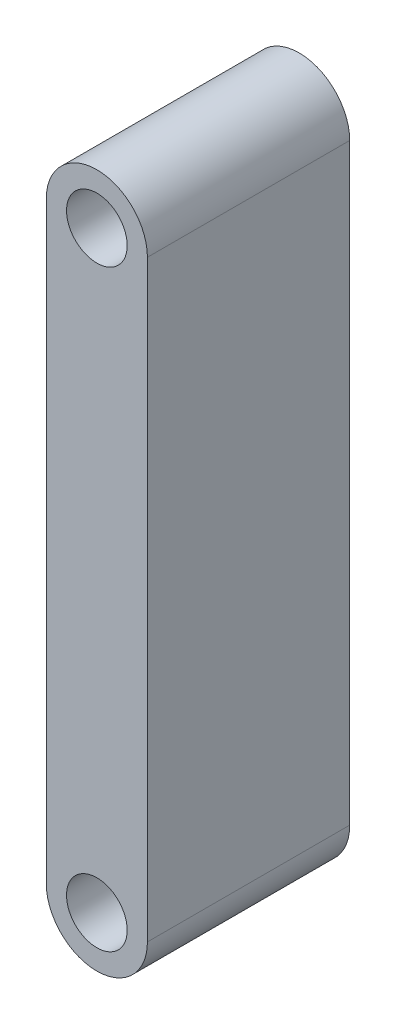
ISO-10303-21;
HEADER;
FILE_DESCRIPTION(('STEP AP214'),'2;1');
FILE_NAME('part.step','',(''),(''),'','','');
FILE_SCHEMA(('AUTOMOTIVE_DESIGN { 1 0 10303 214 1 1 1 1 }'));
ENDSEC;
DATA;
#1=APPLICATION_CONTEXT('core data for automotive mechanical design processes');
#2=APPLICATION_PROTOCOL_DEFINITION('international standard','automotive_design',2000,#1);
#3=PRODUCT_CONTEXT('',#1,'mechanical');
#4=PRODUCT('Part','Part','',(#3));
#5=PRODUCT_RELATED_PRODUCT_CATEGORY('part','',(#4));
#6=PRODUCT_DEFINITION_FORMATION('','',#4);
#7=PRODUCT_DEFINITION_CONTEXT('part definition',#1,'design');
#8=PRODUCT_DEFINITION('design','',#6,#7);
#9=PRODUCT_DEFINITION_SHAPE('','',#8);
#10=(LENGTH_UNIT() NAMED_UNIT(*) SI_UNIT(.MILLI.,.METRE.));
#11=(NAMED_UNIT(*) PLANE_ANGLE_UNIT() SI_UNIT($,.RADIAN.));
#12=(NAMED_UNIT(*) SI_UNIT($,.STERADIAN.) SOLID_ANGLE_UNIT());
#13=UNCERTAINTY_MEASURE_WITH_UNIT(LENGTH_MEASURE(1.E-05),#10,'distance_accuracy_value','');
#14=(GEOMETRIC_REPRESENTATION_CONTEXT(3) GLOBAL_UNCERTAINTY_ASSIGNED_CONTEXT((#13)) GLOBAL_UNIT_ASSIGNED_CONTEXT((#10,
#11,#12)) REPRESENTATION_CONTEXT('',''));
#15=CARTESIAN_POINT('',(0.,0.,0.));
#16=DIRECTION('',(0.,0.,1.));
#17=DIRECTION('',(1.,0.,0.));
#18=AXIS2_PLACEMENT_3D('',#15,#16,#17);
#19=CARTESIAN_POINT('',(0.,253.456382451077,50.));
#20=DIRECTION('',(0.,0.,1.));
#21=DIRECTION('',(1.,0.,0.));
#22=AXIS2_PLACEMENT_3D('',#19,#20,#21);
#23=PLANE('',#22);
#24=CARTESIAN_POINT('',(0.,253.456382451077,50.));
#25=DIRECTION('',(0.,0.,1.));
#26=DIRECTION('',(1.,0.,0.));
#27=AXIS2_PLACEMENT_3D('',#24,#25,#26);
#28=CIRCLE('',#27,15.);
#29=CARTESIAN_POINT('',(15.,253.456382451077,50.));
#30=VERTEX_POINT('',#29);
#31=EDGE_CURVE('E112',#30,#30,#28,.T.);
#32=ORIENTED_EDGE('',*,*,#31,.F.);
#33=EDGE_LOOP('',(#32));
#34=FACE_BOUND('',#33,.T.);
#35=CARTESIAN_POINT('',(0.,253.456382451077,50.));
#36=DIRECTION('',(0.,0.,1.));
#37=DIRECTION('',(1.,0.,0.));
#38=AXIS2_PLACEMENT_3D('',#35,#36,#37);
#39=CIRCLE('',#38,25.);
#40=CARTESIAN_POINT('',(25.,253.456382451077,50.));
#41=VERTEX_POINT('',#40);
#42=CARTESIAN_POINT('',(-25.,253.456382451077,50.));
#43=VERTEX_POINT('',#42);
#44=EDGE_CURVE('E92',#41,#43,#39,.T.);
#45=ORIENTED_EDGE('',*,*,#44,.T.);
#46=DIRECTION('',(0.,-1.,0.));
#47=VECTOR('',#46,1.);
#48=CARTESIAN_POINT('',(-25.,253.456382451077,50.));
#49=LINE('',#48,#47);
#50=CARTESIAN_POINT('',(-25.,-39.6436175489231,50.));
#51=VERTEX_POINT('',#50);
#52=EDGE_CURVE('E87',#43,#51,#49,.T.);
#53=ORIENTED_EDGE('',*,*,#52,.T.);
#54=CARTESIAN_POINT('',(0.,-39.6436175489231,50.));
#55=DIRECTION('',(0.,0.,1.));
#56=DIRECTION('',(1.,0.,0.));
#57=AXIS2_PLACEMENT_3D('',#54,#55,#56);
#58=CIRCLE('',#57,25.);
#59=CARTESIAN_POINT('',(25.,-39.6436175489231,50.));
#60=VERTEX_POINT('',#59);
#61=EDGE_CURVE('E90',#51,#60,#58,.T.);
#62=ORIENTED_EDGE('',*,*,#61,.T.);
#63=DIRECTION('',(0.,1.,0.));
#64=VECTOR('',#63,1.);
#65=CARTESIAN_POINT('',(25.,253.456382451077,50.));
#66=LINE('',#65,#64);
#67=EDGE_CURVE('E57',#60,#41,#66,.T.);
#68=ORIENTED_EDGE('',*,*,#67,.T.);
#69=EDGE_LOOP('',(#45,#53,#62,#68));
#70=FACE_BOUND('',#69,.T.);
#71=CARTESIAN_POINT('',(0.,-39.6436175489231,50.));
#72=DIRECTION('',(0.,0.,1.));
#73=DIRECTION('',(1.,0.,0.));
#74=AXIS2_PLACEMENT_3D('',#71,#72,#73);
#75=CIRCLE('',#74,15.);
#76=CARTESIAN_POINT('',(15.,-39.6436175489231,50.));
#77=VERTEX_POINT('',#76);
#78=EDGE_CURVE('E134',#77,#77,#75,.T.);
#79=ORIENTED_EDGE('',*,*,#78,.F.);
#80=EDGE_LOOP('',(#79));
#81=FACE_BOUND('',#80,.T.);
#82=ADVANCED_FACE('F39',(#34,#70,#81),#23,.T.);
#83=CARTESIAN_POINT('',(0.,253.456382451077,-50.));
#84=DIRECTION('',(0.,0.,1.));
#85=DIRECTION('',(1.,0.,0.));
#86=AXIS2_PLACEMENT_3D('',#83,#84,#85);
#87=PLANE('',#86);
#88=CARTESIAN_POINT('',(0.,253.456382451077,-50.));
#89=DIRECTION('',(0.,0.,1.));
#90=DIRECTION('',(1.,0.,0.));
#91=AXIS2_PLACEMENT_3D('',#88,#89,#90);
#92=CIRCLE('',#91,25.);
#93=CARTESIAN_POINT('',(25.,253.456382451077,-50.));
#94=VERTEX_POINT('',#93);
#95=CARTESIAN_POINT('',(-25.,253.456382451077,-50.));
#96=VERTEX_POINT('',#95);
#97=EDGE_CURVE('E108',#94,#96,#92,.T.);
#98=ORIENTED_EDGE('',*,*,#97,.F.);
#99=DIRECTION('',(0.,1.,0.));
#100=VECTOR('',#99,1.);
#101=CARTESIAN_POINT('',(25.,253.456382451077,-50.));
#102=LINE('',#101,#100);
#103=CARTESIAN_POINT('',(25.,-39.6436175489231,-50.));
#104=VERTEX_POINT('',#103);
#105=EDGE_CURVE('E80',#104,#94,#102,.T.);
#106=ORIENTED_EDGE('',*,*,#105,.F.);
#107=CARTESIAN_POINT('',(0.,-39.6436175489231,-50.));
#108=DIRECTION('',(0.,0.,1.));
#109=DIRECTION('',(1.,0.,0.));
#110=AXIS2_PLACEMENT_3D('',#107,#108,#109);
#111=CIRCLE('',#110,25.);
#112=CARTESIAN_POINT('',(-25.,-39.6436175489231,-50.));
#113=VERTEX_POINT('',#112);
#114=EDGE_CURVE('E74',#113,#104,#111,.T.);
#115=ORIENTED_EDGE('',*,*,#114,.F.);
#116=DIRECTION('',(0.,-1.,0.));
#117=VECTOR('',#116,1.);
#118=CARTESIAN_POINT('',(-25.,253.456382451077,-50.));
#119=LINE('',#118,#117);
#120=EDGE_CURVE('E97',#96,#113,#119,.T.);
#121=ORIENTED_EDGE('',*,*,#120,.F.);
#122=EDGE_LOOP('',(#98,#106,#115,#121));
#123=FACE_BOUND('',#122,.T.);
#124=CARTESIAN_POINT('',(0.,253.456382451077,-50.));
#125=DIRECTION('',(0.,0.,1.));
#126=DIRECTION('',(1.,0.,0.));
#127=AXIS2_PLACEMENT_3D('',#124,#125,#126);
#128=CIRCLE('',#127,15.);
#129=CARTESIAN_POINT('',(15.,253.456382451077,-50.));
#130=VERTEX_POINT('',#129);
#131=EDGE_CURVE('E130',#130,#130,#128,.T.);
#132=ORIENTED_EDGE('',*,*,#131,.T.);
#133=EDGE_LOOP('',(#132));
#134=FACE_BOUND('',#133,.T.);
#135=CARTESIAN_POINT('',(0.,-39.6436175489231,-50.));
#136=DIRECTION('',(0.,0.,1.));
#137=DIRECTION('',(1.,0.,0.));
#138=AXIS2_PLACEMENT_3D('',#135,#136,#137);
#139=CIRCLE('',#138,15.);
#140=CARTESIAN_POINT('',(15.,-39.6436175489231,-50.));
#141=VERTEX_POINT('',#140);
#142=EDGE_CURVE('E138',#141,#141,#139,.T.);
#143=ORIENTED_EDGE('',*,*,#142,.T.);
#144=EDGE_LOOP('',(#143));
#145=FACE_BOUND('',#144,.T.);
#146=ADVANCED_FACE('F125',(#123,#134,#145),#87,.F.);
#147=CARTESIAN_POINT('',(0.,253.456382451077,50.));
#148=DIRECTION('',(0.,0.,-1.));
#149=DIRECTION('',(-1.,0.,0.));
#150=AXIS2_PLACEMENT_3D('',#147,#148,#149);
#151=CYLINDRICAL_SURFACE('',#150,25.);
#152=ORIENTED_EDGE('',*,*,#97,.T.);
#153=DIRECTION('',(0.,0.,-1.));
#154=VECTOR('',#153,1.);
#155=CARTESIAN_POINT('',(-25.,253.456382451077,50.));
#156=LINE('',#155,#154);
#157=EDGE_CURVE('E11',#43,#96,#156,.T.);
#158=ORIENTED_EDGE('',*,*,#157,.F.);
#159=ORIENTED_EDGE('',*,*,#44,.F.);
#160=DIRECTION('',(0.,0.,-1.));
#161=VECTOR('',#160,1.);
#162=CARTESIAN_POINT('',(25.,253.456382451077,50.));
#163=LINE('',#162,#161);
#164=EDGE_CURVE('E104',#41,#94,#163,.T.);
#165=ORIENTED_EDGE('',*,*,#164,.T.);
#166=EDGE_LOOP('',(#152,#158,#159,#165));
#167=FACE_BOUND('',#166,.T.);
#168=ADVANCED_FACE('F41',(#167),#151,.T.);
#169=CARTESIAN_POINT('',(-25.,253.456382451077,50.));
#170=DIRECTION('',(1.,0.,0.));
#171=DIRECTION('',(0.,1.,0.));
#172=AXIS2_PLACEMENT_3D('',#169,#170,#171);
#173=PLANE('',#172);
#174=ORIENTED_EDGE('',*,*,#120,.T.);
#175=DIRECTION('',(0.,0.,-1.));
#176=VECTOR('',#175,1.);
#177=CARTESIAN_POINT('',(-25.,-39.6436175489231,50.));
#178=LINE('',#177,#176);
#179=EDGE_CURVE('E49',#51,#113,#178,.T.);
#180=ORIENTED_EDGE('',*,*,#179,.F.);
#181=ORIENTED_EDGE('',*,*,#52,.F.);
#182=ORIENTED_EDGE('',*,*,#157,.T.);
#183=EDGE_LOOP('',(#174,#180,#181,#182));
#184=FACE_BOUND('',#183,.T.);
#185=ADVANCED_FACE('F96',(#184),#173,.F.);
#186=CARTESIAN_POINT('',(0.,-39.6436175489231,50.));
#187=DIRECTION('',(0.,0.,-1.));
#188=DIRECTION('',(-1.,0.,0.));
#189=AXIS2_PLACEMENT_3D('',#186,#187,#188);
#190=CYLINDRICAL_SURFACE('',#189,25.);
#191=ORIENTED_EDGE('',*,*,#114,.T.);
#192=DIRECTION('',(0.,0.,-1.));
#193=VECTOR('',#192,1.);
#194=CARTESIAN_POINT('',(25.,-39.6436175489231,50.));
#195=LINE('',#194,#193);
#196=EDGE_CURVE('E99',#60,#104,#195,.T.);
#197=ORIENTED_EDGE('',*,*,#196,.F.);
#198=ORIENTED_EDGE('',*,*,#61,.F.);
#199=ORIENTED_EDGE('',*,*,#179,.T.);
#200=EDGE_LOOP('',(#191,#197,#198,#199));
#201=FACE_BOUND('',#200,.T.);
#202=ADVANCED_FACE('F100',(#201),#190,.T.);
#203=CARTESIAN_POINT('',(25.,253.456382451077,50.));
#204=DIRECTION('',(-1.,0.,0.));
#205=DIRECTION('',(0.,-1.,0.));
#206=AXIS2_PLACEMENT_3D('',#203,#204,#205);
#207=PLANE('',#206);
#208=ORIENTED_EDGE('',*,*,#105,.T.);
#209=ORIENTED_EDGE('',*,*,#164,.F.);
#210=ORIENTED_EDGE('',*,*,#67,.F.);
#211=ORIENTED_EDGE('',*,*,#196,.T.);
#212=EDGE_LOOP('',(#208,#209,#210,#211));
#213=FACE_BOUND('',#212,.T.);
#214=ADVANCED_FACE('F122',(#213),#207,.F.);
#215=CARTESIAN_POINT('',(0.,253.456382451077,50.));
#216=DIRECTION('',(0.,0.,-1.));
#217=DIRECTION('',(-1.,0.,0.));
#218=AXIS2_PLACEMENT_3D('',#215,#216,#217);
#219=CYLINDRICAL_SURFACE('',#218,15.);
#220=ORIENTED_EDGE('',*,*,#31,.T.);
#221=EDGE_LOOP('',(#220));
#222=FACE_BOUND('',#221,.T.);
#223=ORIENTED_EDGE('',*,*,#131,.F.);
#224=EDGE_LOOP('',(#223));
#225=FACE_BOUND('',#224,.T.);
#226=ADVANCED_FACE('F157',(#222,#225),#219,.F.);
#227=CARTESIAN_POINT('',(0.,-39.6436175489231,50.));
#228=DIRECTION('',(0.,0.,-1.));
#229=DIRECTION('',(-1.,0.,0.));
#230=AXIS2_PLACEMENT_3D('',#227,#228,#229);
#231=CYLINDRICAL_SURFACE('',#230,15.);
#232=ORIENTED_EDGE('',*,*,#78,.T.);
#233=EDGE_LOOP('',(#232));
#234=FACE_BOUND('',#233,.T.);
#235=ORIENTED_EDGE('',*,*,#142,.F.);
#236=EDGE_LOOP('',(#235));
#237=FACE_BOUND('',#236,.T.);
#238=ADVANCED_FACE('F146',(#234,#237),#231,.F.);
#239=CLOSED_SHELL('',(#82,#146,#168,#185,#202,#214,#226,#238));
#240=MANIFOLD_SOLID_BREP('B2',#239);
#241=ADVANCED_BREP_SHAPE_REPRESENTATION('',(#18,#240),#14);
#242=SHAPE_DEFINITION_REPRESENTATION(#9,#241);
ENDSEC;
END-ISO-10303-21;
